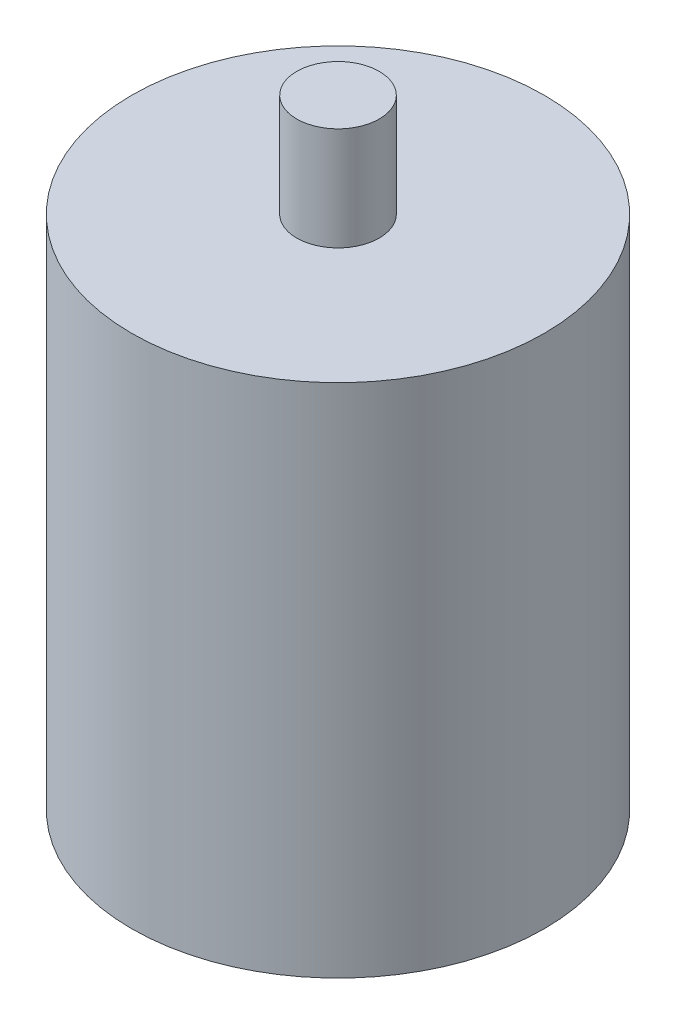
ISO-10303-21;
HEADER;
FILE_DESCRIPTION(('STEP AP214'),'2;1');
FILE_NAME('part.step','',(''),(''),'','','');
FILE_SCHEMA(('AUTOMOTIVE_DESIGN { 1 0 10303 214 1 1 1 1 }'));
ENDSEC;
DATA;
#1=APPLICATION_CONTEXT('core data for automotive mechanical design processes');
#2=APPLICATION_PROTOCOL_DEFINITION('international standard','automotive_design',2000,#1);
#3=PRODUCT_CONTEXT('',#1,'mechanical');
#4=PRODUCT('Part','Part','',(#3));
#5=PRODUCT_RELATED_PRODUCT_CATEGORY('part','',(#4));
#6=PRODUCT_DEFINITION_FORMATION('','',#4);
#7=PRODUCT_DEFINITION_CONTEXT('part definition',#1,'design');
#8=PRODUCT_DEFINITION('design','',#6,#7);
#9=PRODUCT_DEFINITION_SHAPE('','',#8);
#10=(LENGTH_UNIT() NAMED_UNIT(*) SI_UNIT(.MILLI.,.METRE.));
#11=(NAMED_UNIT(*) PLANE_ANGLE_UNIT() SI_UNIT($,.RADIAN.));
#12=(NAMED_UNIT(*) SI_UNIT($,.STERADIAN.) SOLID_ANGLE_UNIT());
#13=UNCERTAINTY_MEASURE_WITH_UNIT(LENGTH_MEASURE(1.E-05),#10,'distance_accuracy_value','');
#14=(GEOMETRIC_REPRESENTATION_CONTEXT(3) GLOBAL_UNCERTAINTY_ASSIGNED_CONTEXT((#13)) GLOBAL_UNIT_ASSIGNED_CONTEXT((#10,
#11,#12)) REPRESENTATION_CONTEXT('',''));
#15=CARTESIAN_POINT('',(0.,0.,0.));
#16=DIRECTION('',(0.,0.,1.));
#17=DIRECTION('',(1.,0.,0.));
#18=AXIS2_PLACEMENT_3D('',#15,#16,#17);
#19=CARTESIAN_POINT('',(0.,50.,0.));
#20=DIRECTION('',(0.,-1.,0.));
#21=DIRECTION('',(0.,0.,-1.));
#22=AXIS2_PLACEMENT_3D('',#19,#20,#21);
#23=CYLINDRICAL_SURFACE('',#22,20.);
#24=CARTESIAN_POINT('',(0.,50.,0.));
#25=DIRECTION('',(0.,1.,0.));
#26=DIRECTION('',(0.,0.,1.));
#27=AXIS2_PLACEMENT_3D('',#24,#25,#26);
#28=CIRCLE('',#27,20.);
#29=CARTESIAN_POINT('',(0.,50.,20.));
#30=VERTEX_POINT('',#29);
#31=EDGE_CURVE('E46',#30,#30,#28,.T.);
#32=ORIENTED_EDGE('',*,*,#31,.F.);
#33=EDGE_LOOP('',(#32));
#34=FACE_BOUND('',#33,.T.);
#35=CARTESIAN_POINT('',(0.,0.,0.));
#36=DIRECTION('',(0.,1.,0.));
#37=DIRECTION('',(0.,0.,1.));
#38=AXIS2_PLACEMENT_3D('',#35,#36,#37);
#39=CIRCLE('',#38,20.);
#40=CARTESIAN_POINT('',(0.,0.,20.));
#41=VERTEX_POINT('',#40);
#42=EDGE_CURVE('E37',#41,#41,#39,.T.);
#43=ORIENTED_EDGE('',*,*,#42,.T.);
#44=EDGE_LOOP('',(#43));
#45=FACE_BOUND('',#44,.T.);
#46=ADVANCED_FACE('F34',(#34,#45),#23,.T.);
#47=CARTESIAN_POINT('',(0.,50.,0.));
#48=DIRECTION('',(0.,1.,0.));
#49=DIRECTION('',(0.,0.,1.));
#50=AXIS2_PLACEMENT_3D('',#47,#48,#49);
#51=PLANE('',#50);
#52=CARTESIAN_POINT('',(0.,50.,0.));
#53=DIRECTION('',(0.,1.,0.));
#54=DIRECTION('',(0.,0.,1.));
#55=AXIS2_PLACEMENT_3D('',#52,#53,#54);
#56=CIRCLE('',#55,4.);
#57=CARTESIAN_POINT('',(0.,50.,4.));
#58=VERTEX_POINT('',#57);
#59=EDGE_CURVE('E10',#58,#58,#56,.T.);
#60=ORIENTED_EDGE('',*,*,#59,.F.);
#61=EDGE_LOOP('',(#60));
#62=FACE_BOUND('',#61,.T.);
#63=ORIENTED_EDGE('',*,*,#31,.T.);
#64=EDGE_LOOP('',(#63));
#65=FACE_BOUND('',#64,.T.);
#66=ADVANCED_FACE('F63',(#62,#65),#51,.T.);
#67=CARTESIAN_POINT('',(0.,0.,0.));
#68=DIRECTION('',(0.,1.,0.));
#69=DIRECTION('',(0.,0.,1.));
#70=AXIS2_PLACEMENT_3D('',#67,#68,#69);
#71=PLANE('',#70);
#72=CARTESIAN_POINT('',(0.,0.,0.));
#73=DIRECTION('',(0.,-1.,0.));
#74=DIRECTION('',(0.,0.,-1.));
#75=AXIS2_PLACEMENT_3D('',#72,#73,#74);
#76=CIRCLE('',#75,3.);
#77=CARTESIAN_POINT('',(0.,0.,-3.));
#78=VERTEX_POINT('',#77);
#79=EDGE_CURVE('E41',#78,#78,#76,.T.);
#80=ORIENTED_EDGE('',*,*,#79,.F.);
#81=EDGE_LOOP('',(#80));
#82=FACE_BOUND('',#81,.T.);
#83=ORIENTED_EDGE('',*,*,#42,.F.);
#84=EDGE_LOOP('',(#83));
#85=FACE_BOUND('',#84,.T.);
#86=ADVANCED_FACE('F60',(#82,#85),#71,.F.);
#87=CARTESIAN_POINT('',(0.,-5.,0.));
#88=DIRECTION('',(0.,1.,0.));
#89=DIRECTION('',(0.,0.,1.));
#90=AXIS2_PLACEMENT_3D('',#87,#88,#89);
#91=CYLINDRICAL_SURFACE('',#90,3.);
#92=CARTESIAN_POINT('',(0.,-5.,0.));
#93=DIRECTION('',(0.,-1.,0.));
#94=DIRECTION('',(0.,0.,-1.));
#95=AXIS2_PLACEMENT_3D('',#92,#93,#94);
#96=CIRCLE('',#95,3.);
#97=CARTESIAN_POINT('',(0.,-5.,-3.));
#98=VERTEX_POINT('',#97);
#99=EDGE_CURVE('E51',#98,#98,#96,.T.);
#100=ORIENTED_EDGE('',*,*,#99,.F.);
#101=EDGE_LOOP('',(#100));
#102=FACE_BOUND('',#101,.T.);
#103=ORIENTED_EDGE('',*,*,#79,.T.);
#104=EDGE_LOOP('',(#103));
#105=FACE_BOUND('',#104,.T.);
#106=ADVANCED_FACE('F62',(#102,#105),#91,.T.);
#107=CARTESIAN_POINT('',(0.,-5.,0.));
#108=DIRECTION('',(0.,-1.,0.));
#109=DIRECTION('',(0.,0.,-1.));
#110=AXIS2_PLACEMENT_3D('',#107,#108,#109);
#111=PLANE('',#110);
#112=ORIENTED_EDGE('',*,*,#99,.T.);
#113=EDGE_LOOP('',(#112));
#114=FACE_BOUND('',#113,.T.);
#115=ADVANCED_FACE('F69',(#114),#111,.T.);
#116=CARTESIAN_POINT('',(0.,60.,0.));
#117=DIRECTION('',(0.,-1.,0.));
#118=DIRECTION('',(0.,0.,-1.));
#119=AXIS2_PLACEMENT_3D('',#116,#117,#118);
#120=CYLINDRICAL_SURFACE('',#119,4.);
#121=CARTESIAN_POINT('',(0.,60.,0.));
#122=DIRECTION('',(0.,1.,0.));
#123=DIRECTION('',(0.,0.,1.));
#124=AXIS2_PLACEMENT_3D('',#121,#122,#123);
#125=CIRCLE('',#124,4.);
#126=CARTESIAN_POINT('',(0.,60.,4.));
#127=VERTEX_POINT('',#126);
#128=EDGE_CURVE('E50',#127,#127,#125,.T.);
#129=ORIENTED_EDGE('',*,*,#128,.F.);
#130=EDGE_LOOP('',(#129));
#131=FACE_BOUND('',#130,.T.);
#132=ORIENTED_EDGE('',*,*,#59,.T.);
#133=EDGE_LOOP('',(#132));
#134=FACE_BOUND('',#133,.T.);
#135=ADVANCED_FACE('F94',(#131,#134),#120,.T.);
#136=CARTESIAN_POINT('',(0.,60.,0.));
#137=DIRECTION('',(0.,1.,0.));
#138=DIRECTION('',(0.,0.,1.));
#139=AXIS2_PLACEMENT_3D('',#136,#137,#138);
#140=PLANE('',#139);
#141=ORIENTED_EDGE('',*,*,#128,.T.);
#142=EDGE_LOOP('',(#141));
#143=FACE_BOUND('',#142,.T.);
#144=ADVANCED_FACE('F99',(#143),#140,.T.);
#145=CLOSED_SHELL('',(#46,#66,#86,#106,#115,#135,#144));
#146=MANIFOLD_SOLID_BREP('B2',#145);
#147=ADVANCED_BREP_SHAPE_REPRESENTATION('',(#18,#146),#14);
#148=SHAPE_DEFINITION_REPRESENTATION(#9,#147);
ENDSEC;
END-ISO-10303-21;
